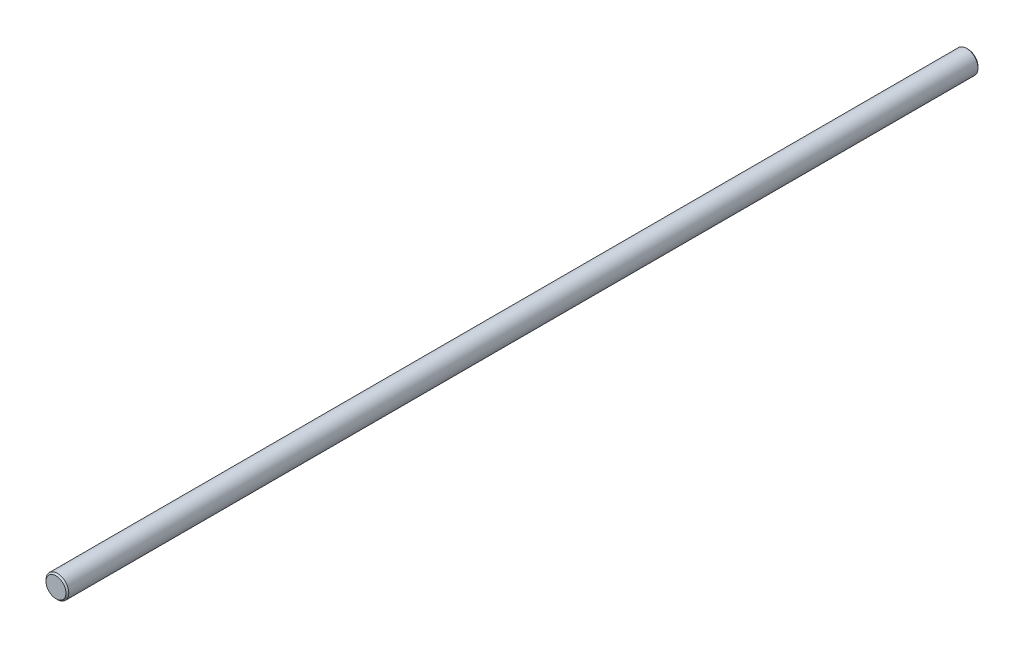
ISO-10303-21;
HEADER;
FILE_DESCRIPTION(('STEP AP214'),'2;1');
FILE_NAME('part.step','',(''),(''),'','','');
FILE_SCHEMA(('AUTOMOTIVE_DESIGN { 1 0 10303 214 1 1 1 1 }'));
ENDSEC;
DATA;
#1=APPLICATION_CONTEXT('core data for automotive mechanical design processes');
#2=APPLICATION_PROTOCOL_DEFINITION('international standard','automotive_design',2000,#1);
#3=PRODUCT_CONTEXT('',#1,'mechanical');
#4=PRODUCT('Part','Part','',(#3));
#5=PRODUCT_RELATED_PRODUCT_CATEGORY('part','',(#4));
#6=PRODUCT_DEFINITION_FORMATION('','',#4);
#7=PRODUCT_DEFINITION_CONTEXT('part definition',#1,'design');
#8=PRODUCT_DEFINITION('design','',#6,#7);
#9=PRODUCT_DEFINITION_SHAPE('','',#8);
#10=(LENGTH_UNIT() NAMED_UNIT(*) SI_UNIT(.MILLI.,.METRE.));
#11=(NAMED_UNIT(*) PLANE_ANGLE_UNIT() SI_UNIT($,.RADIAN.));
#12=(NAMED_UNIT(*) SI_UNIT($,.STERADIAN.) SOLID_ANGLE_UNIT());
#13=UNCERTAINTY_MEASURE_WITH_UNIT(LENGTH_MEASURE(1.E-05),#10,'distance_accuracy_value','');
#14=(GEOMETRIC_REPRESENTATION_CONTEXT(3) GLOBAL_UNCERTAINTY_ASSIGNED_CONTEXT((#13)) GLOBAL_UNIT_ASSIGNED_CONTEXT((#10,
#11,#12)) REPRESENTATION_CONTEXT('',''));
#15=CARTESIAN_POINT('',(0.,0.,0.));
#16=DIRECTION('',(0.,0.,1.));
#17=DIRECTION('',(1.,0.,0.));
#18=AXIS2_PLACEMENT_3D('',#15,#16,#17);
#19=CARTESIAN_POINT('',(0.,0.,320.));
#20=DIRECTION('',(0.,0.,-1.));
#21=DIRECTION('',(-1.,0.,0.));
#22=AXIS2_PLACEMENT_3D('',#19,#20,#21);
#23=CYLINDRICAL_SURFACE('',#22,4.);
#24=CARTESIAN_POINT('',(0.,0.,319.5));
#25=DIRECTION('',(0.,0.,1.));
#26=DIRECTION('',(1.,0.,0.));
#27=AXIS2_PLACEMENT_3D('',#24,#25,#26);
#28=CIRCLE('',#27,4.);
#29=CARTESIAN_POINT('',(4.,0.,319.5));
#30=VERTEX_POINT('',#29);
#31=EDGE_CURVE('E39',#30,#30,#28,.F.);
#32=ORIENTED_EDGE('',*,*,#31,.T.);
#33=EDGE_LOOP('',(#32));
#34=FACE_BOUND('',#33,.T.);
#35=CARTESIAN_POINT('',(0.,0.,0.500000000000056));
#36=DIRECTION('',(0.,0.,1.));
#37=DIRECTION('',(1.,0.,0.));
#38=AXIS2_PLACEMENT_3D('',#35,#36,#37);
#39=CIRCLE('',#38,4.);
#40=CARTESIAN_POINT('',(4.,0.,0.500000000000056));
#41=VERTEX_POINT('',#40);
#42=EDGE_CURVE('E43',#41,#41,#39,.T.);
#43=ORIENTED_EDGE('',*,*,#42,.T.);
#44=EDGE_LOOP('',(#43));
#45=FACE_BOUND('',#44,.T.);
#46=ADVANCED_FACE('F32',(#34,#45),#23,.T.);
#47=CARTESIAN_POINT('',(0.,0.,320.));
#48=DIRECTION('',(0.,0.,1.));
#49=DIRECTION('',(1.,0.,0.));
#50=AXIS2_PLACEMENT_3D('',#47,#48,#49);
#51=PLANE('',#50);
#52=CARTESIAN_POINT('',(0.,0.,320.));
#53=DIRECTION('',(0.,0.,1.));
#54=DIRECTION('',(1.,0.,0.));
#55=AXIS2_PLACEMENT_3D('',#52,#53,#54);
#56=CIRCLE('',#55,3.50000000000009);
#57=CARTESIAN_POINT('',(3.50000000000009,0.,320.));
#58=VERTEX_POINT('',#57);
#59=EDGE_CURVE('E47',#58,#58,#56,.T.);
#60=ORIENTED_EDGE('',*,*,#59,.T.);
#61=EDGE_LOOP('',(#60));
#62=FACE_BOUND('',#61,.T.);
#63=ADVANCED_FACE('F53',(#62),#51,.T.);
#64=CARTESIAN_POINT('',(0.,0.,0.));
#65=DIRECTION('',(0.,0.,1.));
#66=DIRECTION('',(1.,0.,0.));
#67=AXIS2_PLACEMENT_3D('',#64,#65,#66);
#68=PLANE('',#67);
#69=CARTESIAN_POINT('',(0.,0.,0.));
#70=DIRECTION('',(0.,0.,1.));
#71=DIRECTION('',(1.,0.,0.));
#72=AXIS2_PLACEMENT_3D('',#69,#70,#71);
#73=CIRCLE('',#72,3.49999999999992);
#74=CARTESIAN_POINT('',(3.49999999999992,0.,0.));
#75=VERTEX_POINT('',#74);
#76=EDGE_CURVE('E10',#75,#75,#73,.F.);
#77=ORIENTED_EDGE('',*,*,#76,.T.);
#78=EDGE_LOOP('',(#77));
#79=FACE_BOUND('',#78,.T.);
#80=ADVANCED_FACE('F57',(#79),#68,.F.);
#81=CARTESIAN_POINT('',(0.,0.,320.));
#82=DIRECTION('',(0.,0.,-1.));
#83=DIRECTION('',(-1.,0.,0.));
#84=AXIS2_PLACEMENT_3D('',#81,#82,#83);
#85=CONICAL_SURFACE('',#84,3.50000000000009,0.785398163397528);
#86=ORIENTED_EDGE('',*,*,#31,.F.);
#87=EDGE_LOOP('',(#86));
#88=FACE_BOUND('',#87,.T.);
#89=ORIENTED_EDGE('',*,*,#59,.F.);
#90=EDGE_LOOP('',(#89));
#91=FACE_BOUND('',#90,.T.);
#92=ADVANCED_FACE('F55',(#88,#91),#85,.T.);
#93=CARTESIAN_POINT('',(0.,0.,0.500000000000056));
#94=DIRECTION('',(0.,0.,1.));
#95=DIRECTION('',(1.,0.,0.));
#96=AXIS2_PLACEMENT_3D('',#93,#94,#95);
#97=CONICAL_SURFACE('',#96,4.,0.785398163397473);
#98=ORIENTED_EDGE('',*,*,#76,.F.);
#99=EDGE_LOOP('',(#98));
#100=FACE_BOUND('',#99,.T.);
#101=ORIENTED_EDGE('',*,*,#42,.F.);
#102=EDGE_LOOP('',(#101));
#103=FACE_BOUND('',#102,.T.);
#104=ADVANCED_FACE('F34',(#100,#103),#97,.T.);
#105=CLOSED_SHELL('',(#46,#63,#80,#92,#104));
#106=MANIFOLD_SOLID_BREP('B2',#105);
#107=ADVANCED_BREP_SHAPE_REPRESENTATION('',(#18,#106),#14);
#108=SHAPE_DEFINITION_REPRESENTATION(#9,#107);
ENDSEC;
END-ISO-10303-21;
